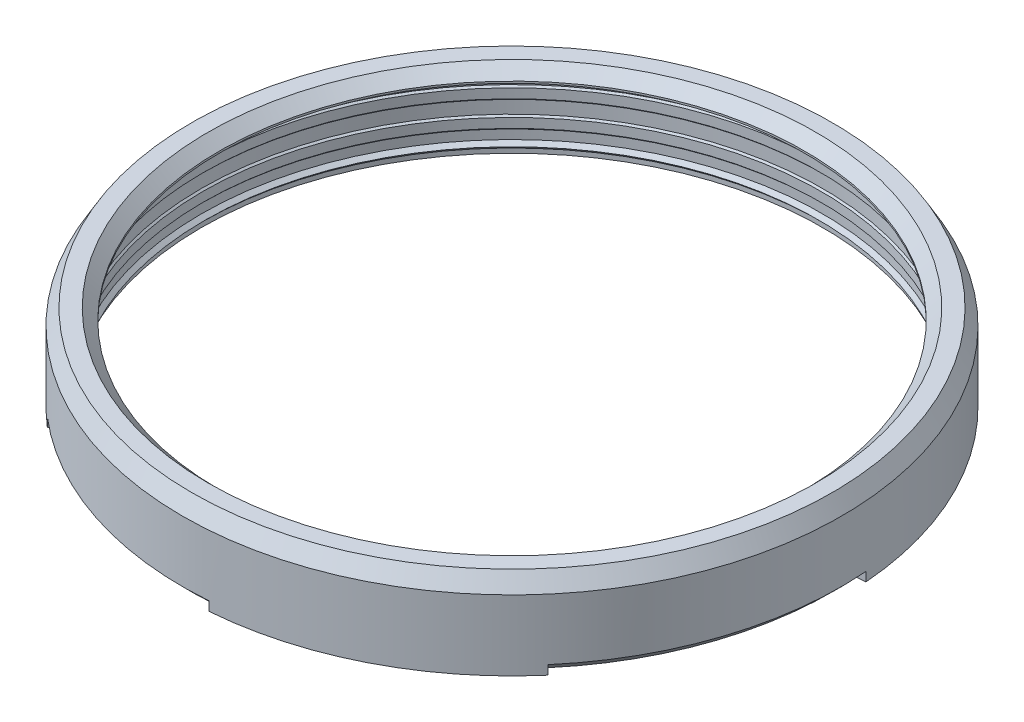
ISO-10303-21;
HEADER;
FILE_DESCRIPTION(('STEP AP214'),'2;1');
FILE_NAME('part.step','',(''),(''),'','','');
FILE_SCHEMA(('AUTOMOTIVE_DESIGN { 1 0 10303 214 1 1 1 1 }'));
ENDSEC;
DATA;
#1=APPLICATION_CONTEXT('core data for automotive mechanical design processes');
#2=APPLICATION_PROTOCOL_DEFINITION('international standard','automotive_design',2000,#1);
#3=PRODUCT_CONTEXT('',#1,'mechanical');
#4=PRODUCT('Part','Part','',(#3));
#5=PRODUCT_RELATED_PRODUCT_CATEGORY('part','',(#4));
#6=PRODUCT_DEFINITION_FORMATION('','',#4);
#7=PRODUCT_DEFINITION_CONTEXT('part definition',#1,'design');
#8=PRODUCT_DEFINITION('design','',#6,#7);
#9=PRODUCT_DEFINITION_SHAPE('','',#8);
#10=(LENGTH_UNIT() NAMED_UNIT(*) SI_UNIT(.MILLI.,.METRE.));
#11=(NAMED_UNIT(*) PLANE_ANGLE_UNIT() SI_UNIT($,.RADIAN.));
#12=(NAMED_UNIT(*) SI_UNIT($,.STERADIAN.) SOLID_ANGLE_UNIT());
#13=UNCERTAINTY_MEASURE_WITH_UNIT(LENGTH_MEASURE(1.E-05),#10,'distance_accuracy_value','');
#14=(GEOMETRIC_REPRESENTATION_CONTEXT(3) GLOBAL_UNCERTAINTY_ASSIGNED_CONTEXT((#13)) GLOBAL_UNIT_ASSIGNED_CONTEXT((#10,
#11,#12)) REPRESENTATION_CONTEXT('',''));
#15=CARTESIAN_POINT('',(0.,0.,0.));
#16=DIRECTION('',(0.,0.,1.));
#17=DIRECTION('',(1.,0.,0.));
#18=AXIS2_PLACEMENT_3D('',#15,#16,#17);
#19=CARTESIAN_POINT('',(0.,2.4,0.));
#20=DIRECTION('',(0.,-1.,0.));
#21=DIRECTION('',(0.,0.,-1.));
#22=AXIS2_PLACEMENT_3D('',#19,#20,#21);
#23=CYLINDRICAL_SURFACE('',#22,36.);
#24=CARTESIAN_POINT('',(0.,-0.33199999999998,0.));
#25=DIRECTION('',(0.,1.,0.));
#26=DIRECTION('',(0.,0.,1.));
#27=AXIS2_PLACEMENT_3D('',#24,#25,#26);
#28=CIRCLE('',#27,36.);
#29=CARTESIAN_POINT('',(0.,-0.33199999999998,36.));
#30=VERTEX_POINT('',#29);
#31=EDGE_CURVE('E314',#30,#30,#28,.F.);
#32=ORIENTED_EDGE('',*,*,#31,.T.);
#33=EDGE_LOOP('',(#32));
#34=FACE_BOUND('',#33,.T.);
#35=CARTESIAN_POINT('',(0.,-8.,0.));
#36=DIRECTION('',(0.,-1.,0.));
#37=DIRECTION('',(1.,0.,0.));
#38=AXIS2_PLACEMENT_3D('',#35,#36,#37);
#39=CIRCLE('',#38,36.);
#40=CARTESIAN_POINT('',(23.4135681346659,-8.,-27.3460203174677));
#41=VERTEX_POINT('',#40);
#42=CARTESIAN_POINT('',(35.892449204742,-8.,-2.7806636051512));
#43=VERTEX_POINT('',#42);
#44=EDGE_CURVE('E155',#41,#43,#39,.T.);
#45=ORIENTED_EDGE('',*,*,#44,.F.);
#46=DIRECTION('',(0.,-1.,0.));
#47=VECTOR('',#46,1.);
#48=CARTESIAN_POINT('',(23.4135681346659,-7.00000000000002,-27.3460203174677));
#49=LINE('',#48,#47);
#50=CARTESIAN_POINT('',(23.4135681346659,-7.00000000000002,-27.3460203174677));
#51=VERTEX_POINT('',#50);
#52=EDGE_CURVE('E196',#51,#41,#49,.T.);
#53=ORIENTED_EDGE('',*,*,#52,.F.);
#54=CARTESIAN_POINT('',(0.,-7.00000000000002,0.));
#55=DIRECTION('',(0.,1.,0.));
#56=DIRECTION('',(0.,0.,-1.));
#57=AXIS2_PLACEMENT_3D('',#54,#55,#56);
#58=CIRCLE('',#57,36.);
#59=CARTESIAN_POINT('',(-2.78066360515108,-7.00000000000002,-35.8924492047421));
#60=VERTEX_POINT('',#59);
#61=EDGE_CURVE('E148',#51,#60,#58,.T.);
#62=ORIENTED_EDGE('',*,*,#61,.T.);
#63=DIRECTION('',(0.,-1.,0.));
#64=VECTOR('',#63,1.);
#65=CARTESIAN_POINT('',(-2.78066360515108,-7.00000000000002,-35.8924492047421));
#66=LINE('',#65,#64);
#67=CARTESIAN_POINT('',(-2.78066360515108,-8.,-35.8924492047421));
#68=VERTEX_POINT('',#67);
#69=EDGE_CURVE('E135',#60,#68,#66,.T.);
#70=ORIENTED_EDGE('',*,*,#69,.T.);
#71=CARTESIAN_POINT('',(-27.3460203174678,-8.,-23.4135681346658));
#72=VERTEX_POINT('',#71);
#73=EDGE_CURVE('E146',#72,#68,#39,.T.);
#74=ORIENTED_EDGE('',*,*,#73,.F.);
#75=DIRECTION('',(0.,-1.,0.));
#76=VECTOR('',#75,1.);
#77=CARTESIAN_POINT('',(-27.3460203174678,-7.00000000000002,-23.4135681346658));
#78=LINE('',#77,#76);
#79=CARTESIAN_POINT('',(-27.3460203174678,-7.00000000000002,-23.4135681346658));
#80=VERTEX_POINT('',#79);
#81=EDGE_CURVE('E183',#80,#72,#78,.T.);
#82=ORIENTED_EDGE('',*,*,#81,.F.);
#83=CARTESIAN_POINT('',(0.,-7.00000000000002,0.));
#84=DIRECTION('',(0.,1.,0.));
#85=DIRECTION('',(-1.,0.,0.));
#86=AXIS2_PLACEMENT_3D('',#83,#84,#85);
#87=CIRCLE('',#86,36.);
#88=CARTESIAN_POINT('',(-35.8924492047421,-7.00000000000002,2.7806636051512));
#89=VERTEX_POINT('',#88);
#90=EDGE_CURVE('E180',#80,#89,#87,.T.);
#91=ORIENTED_EDGE('',*,*,#90,.T.);
#92=DIRECTION('',(0.,-1.,0.));
#93=VECTOR('',#92,1.);
#94=CARTESIAN_POINT('',(-35.8924492047421,-7.00000000000002,2.7806636051512));
#95=LINE('',#94,#93);
#96=CARTESIAN_POINT('',(-35.892449204742,-8.,2.7806636051512));
#97=VERTEX_POINT('',#96);
#98=EDGE_CURVE('E189',#89,#97,#95,.T.);
#99=ORIENTED_EDGE('',*,*,#98,.T.);
#100=CARTESIAN_POINT('',(-23.4135681346661,-8.,27.3460203174676));
#101=VERTEX_POINT('',#100);
#102=EDGE_CURVE('E157',#101,#97,#39,.T.);
#103=ORIENTED_EDGE('',*,*,#102,.F.);
#104=DIRECTION('',(0.,-1.,0.));
#105=VECTOR('',#104,1.);
#106=CARTESIAN_POINT('',(-23.4135681346661,-7.00000000000002,27.3460203174676));
#107=LINE('',#106,#105);
#108=CARTESIAN_POINT('',(-23.4135681346661,-7.00000000000002,27.3460203174676));
#109=VERTEX_POINT('',#108);
#110=EDGE_CURVE('E197',#109,#101,#107,.T.);
#111=ORIENTED_EDGE('',*,*,#110,.F.);
#112=CARTESIAN_POINT('',(0.,-7.00000000000002,0.));
#113=DIRECTION('',(0.,1.,0.));
#114=DIRECTION('',(0.,0.,1.));
#115=AXIS2_PLACEMENT_3D('',#112,#113,#114);
#116=CIRCLE('',#115,36.);
#117=CARTESIAN_POINT('',(2.78066360515083,-7.00000000000002,35.8924492047421));
#118=VERTEX_POINT('',#117);
#119=EDGE_CURVE('E208',#109,#118,#116,.T.);
#120=ORIENTED_EDGE('',*,*,#119,.T.);
#121=DIRECTION('',(0.,-1.,0.));
#122=VECTOR('',#121,1.);
#123=CARTESIAN_POINT('',(2.78066360515083,-7.00000000000002,35.8924492047421));
#124=LINE('',#123,#122);
#125=CARTESIAN_POINT('',(2.78066360515083,-8.,35.8924492047421));
#126=VERTEX_POINT('',#125);
#127=EDGE_CURVE('E214',#118,#126,#124,.T.);
#128=ORIENTED_EDGE('',*,*,#127,.T.);
#129=CARTESIAN_POINT('',(27.3460203174678,-8.,23.4135681346658));
#130=VERTEX_POINT('',#129);
#131=EDGE_CURVE('E162',#130,#126,#39,.T.);
#132=ORIENTED_EDGE('',*,*,#131,.F.);
#133=DIRECTION('',(0.,-1.,0.));
#134=VECTOR('',#133,1.);
#135=CARTESIAN_POINT('',(27.3460203174678,-7.00000000000002,23.4135681346658));
#136=LINE('',#135,#134);
#137=CARTESIAN_POINT('',(27.3460203174678,-7.00000000000002,23.4135681346658));
#138=VERTEX_POINT('',#137);
#139=EDGE_CURVE('E139',#138,#130,#136,.T.);
#140=ORIENTED_EDGE('',*,*,#139,.F.);
#141=CARTESIAN_POINT('',(0.,-7.00000000000002,0.));
#142=DIRECTION('',(0.,1.,0.));
#143=DIRECTION('',(1.,0.,0.));
#144=AXIS2_PLACEMENT_3D('',#141,#142,#143);
#145=CIRCLE('',#144,36.);
#146=CARTESIAN_POINT('',(35.8924492047421,-7.00000000000002,-2.7806636051512));
#147=VERTEX_POINT('',#146);
#148=EDGE_CURVE('E228',#138,#147,#145,.T.);
#149=ORIENTED_EDGE('',*,*,#148,.T.);
#150=DIRECTION('',(0.,-1.,0.));
#151=VECTOR('',#150,1.);
#152=CARTESIAN_POINT('',(35.8924492047421,-7.00000000000002,-2.7806636051512));
#153=LINE('',#152,#151);
#154=EDGE_CURVE('E233',#147,#43,#153,.T.);
#155=ORIENTED_EDGE('',*,*,#154,.T.);
#156=EDGE_LOOP('',(#45,#53,#62,#70,#74,#82,#91,#99,#103,#111,#120,#128,#132,#140,#149,#155));
#157=FACE_BOUND('',#156,.T.);
#158=ADVANCED_FACE('F41',(#34,#157),#23,.T.);
#159=CARTESIAN_POINT('',(0.,-7.6,0.));
#160=DIRECTION('',(0.,1.,0.));
#161=DIRECTION('',(0.,0.,1.));
#162=AXIS2_PLACEMENT_3D('',#159,#160,#161);
#163=CYLINDRICAL_SURFACE('',#162,32.);
#164=CARTESIAN_POINT('',(0.,0.199999999999997,0.));
#165=DIRECTION('',(0.,1.,0.));
#166=DIRECTION('',(0.,0.,1.));
#167=AXIS2_PLACEMENT_3D('',#164,#165,#166);
#168=CIRCLE('',#167,32.);
#169=CARTESIAN_POINT('',(0.,0.199999999999997,32.));
#170=VERTEX_POINT('',#169);
#171=EDGE_CURVE('E11',#170,#170,#168,.T.);
#172=ORIENTED_EDGE('',*,*,#171,.T.);
#173=EDGE_LOOP('',(#172));
#174=FACE_BOUND('',#173,.T.);
#175=CARTESIAN_POINT('',(0.,0.,0.));
#176=DIRECTION('',(0.,1.,0.));
#177=DIRECTION('',(0.,0.,1.));
#178=AXIS2_PLACEMENT_3D('',#175,#176,#177);
#179=CIRCLE('',#178,32.);
#180=CARTESIAN_POINT('',(0.,0.,32.));
#181=VERTEX_POINT('',#180);
#182=EDGE_CURVE('E171',#181,#181,#179,.T.);
#183=ORIENTED_EDGE('',*,*,#182,.F.);
#184=EDGE_LOOP('',(#183));
#185=FACE_BOUND('',#184,.T.);
#186=ADVANCED_FACE('F285',(#174,#185),#163,.F.);
#187=CARTESIAN_POINT('',(0.,-1.5,0.));
#188=DIRECTION('',(0.,-1.,0.));
#189=DIRECTION('',(1.,0.,0.));
#190=AXIS2_PLACEMENT_3D('',#187,#188,#189);
#191=TOROIDAL_SURFACE('',#190,32.44,1.5);
#192=CARTESIAN_POINT('',(0.,0.,0.));
#193=DIRECTION('',(0.,-1.,0.));
#194=DIRECTION('',(1.,0.,0.));
#195=AXIS2_PLACEMENT_3D('',#192,#193,#194);
#196=CIRCLE('',#195,32.44);
#197=CARTESIAN_POINT('',(32.44,0.,0.));
#198=VERTEX_POINT('',#197);
#199=EDGE_CURVE('E164',#198,#198,#196,.T.);
#200=ORIENTED_EDGE('',*,*,#199,.F.);
#201=EDGE_LOOP('',(#200));
#202=FACE_BOUND('',#201,.T.);
#203=CARTESIAN_POINT('',(0.,-1.5,0.));
#204=DIRECTION('',(0.,-1.,0.));
#205=DIRECTION('',(1.,0.,0.));
#206=AXIS2_PLACEMENT_3D('',#203,#204,#205);
#207=CIRCLE('',#206,33.94);
#208=CARTESIAN_POINT('',(33.94,-1.5,0.));
#209=VERTEX_POINT('',#208);
#210=EDGE_CURVE('E319',#209,#209,#207,.T.);
#211=ORIENTED_EDGE('',*,*,#210,.T.);
#212=EDGE_LOOP('',(#211));
#213=FACE_BOUND('',#212,.T.);
#214=ADVANCED_FACE('F291',(#202,#213),#191,.F.);
#215=CARTESIAN_POINT('',(0.,-1.68,0.));
#216=DIRECTION('',(0.,1.,0.));
#217=DIRECTION('',(-1.,0.,0.));
#218=AXIS2_PLACEMENT_3D('',#215,#216,#217);
#219=CONICAL_SURFACE('',#218,33.76,0.785398163397448);
#220=ORIENTED_EDGE('',*,*,#210,.F.);
#221=EDGE_LOOP('',(#220));
#222=FACE_BOUND('',#221,.T.);
#223=CARTESIAN_POINT('',(0.,-1.68,0.));
#224=DIRECTION('',(0.,-1.,0.));
#225=DIRECTION('',(1.,0.,0.));
#226=AXIS2_PLACEMENT_3D('',#223,#224,#225);
#227=CIRCLE('',#226,33.76);
#228=CARTESIAN_POINT('',(33.76,-1.68,0.));
#229=VERTEX_POINT('',#228);
#230=EDGE_CURVE('E323',#229,#229,#227,.T.);
#231=ORIENTED_EDGE('',*,*,#230,.T.);
#232=EDGE_LOOP('',(#231));
#233=FACE_BOUND('',#232,.T.);
#234=ADVANCED_FACE('F407',(#222,#233),#219,.F.);
#235=CARTESIAN_POINT('',(0.,-23.4,0.));
#236=DIRECTION('',(0.,-1.,0.));
#237=DIRECTION('',(1.,0.,0.));
#238=AXIS2_PLACEMENT_3D('',#235,#236,#237);
#239=CYLINDRICAL_SURFACE('',#238,33.76);
#240=ORIENTED_EDGE('',*,*,#230,.F.);
#241=EDGE_LOOP('',(#240));
#242=FACE_BOUND('',#241,.T.);
#243=CARTESIAN_POINT('',(0.,-2.72000000000001,0.));
#244=DIRECTION('',(0.,-1.,0.));
#245=DIRECTION('',(1.,0.,0.));
#246=AXIS2_PLACEMENT_3D('',#243,#244,#245);
#247=CIRCLE('',#246,33.76);
#248=CARTESIAN_POINT('',(33.76,-2.72000000000001,0.));
#249=VERTEX_POINT('',#248);
#250=EDGE_CURVE('E331',#249,#249,#247,.T.);
#251=ORIENTED_EDGE('',*,*,#250,.T.);
#252=EDGE_LOOP('',(#251));
#253=FACE_BOUND('',#252,.T.);
#254=ADVANCED_FACE('F403',(#242,#253),#239,.F.);
#255=CARTESIAN_POINT('',(0.,-2.9,0.));
#256=DIRECTION('',(0.,-1.,0.));
#257=DIRECTION('',(1.,0.,0.));
#258=AXIS2_PLACEMENT_3D('',#255,#256,#257);
#259=CONICAL_SURFACE('',#258,33.94,0.785398163397468);
#260=ORIENTED_EDGE('',*,*,#250,.F.);
#261=EDGE_LOOP('',(#260));
#262=FACE_BOUND('',#261,.T.);
#263=CARTESIAN_POINT('',(0.,-2.9,0.));
#264=DIRECTION('',(0.,-1.,0.));
#265=DIRECTION('',(1.,0.,0.));
#266=AXIS2_PLACEMENT_3D('',#263,#264,#265);
#267=CIRCLE('',#266,33.94);
#268=CARTESIAN_POINT('',(33.94,-2.9,0.));
#269=VERTEX_POINT('',#268);
#270=EDGE_CURVE('E334',#269,#269,#267,.T.);
#271=ORIENTED_EDGE('',*,*,#270,.T.);
#272=EDGE_LOOP('',(#271));
#273=FACE_BOUND('',#272,.T.);
#274=ADVANCED_FACE('F399',(#262,#273),#259,.F.);
#275=CARTESIAN_POINT('',(0.,-23.4,0.));
#276=DIRECTION('',(0.,-1.,0.));
#277=DIRECTION('',(1.,0.,0.));
#278=AXIS2_PLACEMENT_3D('',#275,#276,#277);
#279=CYLINDRICAL_SURFACE('',#278,33.94);
#280=ORIENTED_EDGE('',*,*,#270,.F.);
#281=EDGE_LOOP('',(#280));
#282=FACE_BOUND('',#281,.T.);
#283=CARTESIAN_POINT('',(0.,-4.3,0.));
#284=DIRECTION('',(0.,-1.,0.));
#285=DIRECTION('',(1.,0.,0.));
#286=AXIS2_PLACEMENT_3D('',#283,#284,#285);
#287=CIRCLE('',#286,33.94);
#288=CARTESIAN_POINT('',(33.94,-4.3,0.));
#289=VERTEX_POINT('',#288);
#290=EDGE_CURVE('E337',#289,#289,#287,.T.);
#291=ORIENTED_EDGE('',*,*,#290,.T.);
#292=EDGE_LOOP('',(#291));
#293=FACE_BOUND('',#292,.T.);
#294=ADVANCED_FACE('F395',(#282,#293),#279,.F.);
#295=CARTESIAN_POINT('',(0.,-4.48,0.));
#296=DIRECTION('',(0.,1.,0.));
#297=DIRECTION('',(-1.,0.,0.));
#298=AXIS2_PLACEMENT_3D('',#295,#296,#297);
#299=CONICAL_SURFACE('',#298,33.76,0.785398163397458);
#300=ORIENTED_EDGE('',*,*,#290,.F.);
#301=EDGE_LOOP('',(#300));
#302=FACE_BOUND('',#301,.T.);
#303=CARTESIAN_POINT('',(0.,-4.48,0.));
#304=DIRECTION('',(0.,-1.,0.));
#305=DIRECTION('',(1.,0.,0.));
#306=AXIS2_PLACEMENT_3D('',#303,#304,#305);
#307=CIRCLE('',#306,33.76);
#308=CARTESIAN_POINT('',(33.76,-4.48,0.));
#309=VERTEX_POINT('',#308);
#310=EDGE_CURVE('E340',#309,#309,#307,.T.);
#311=ORIENTED_EDGE('',*,*,#310,.T.);
#312=EDGE_LOOP('',(#311));
#313=FACE_BOUND('',#312,.T.);
#314=ADVANCED_FACE('F391',(#302,#313),#299,.F.);
#315=CARTESIAN_POINT('',(0.,-23.4,0.));
#316=DIRECTION('',(0.,-1.,0.));
#317=DIRECTION('',(1.,0.,0.));
#318=AXIS2_PLACEMENT_3D('',#315,#316,#317);
#319=CYLINDRICAL_SURFACE('',#318,33.76);
#320=ORIENTED_EDGE('',*,*,#310,.F.);
#321=EDGE_LOOP('',(#320));
#322=FACE_BOUND('',#321,.T.);
#323=CARTESIAN_POINT('',(0.,-5.52,0.));
#324=DIRECTION('',(0.,-1.,0.));
#325=DIRECTION('',(1.,0.,0.));
#326=AXIS2_PLACEMENT_3D('',#323,#324,#325);
#327=CIRCLE('',#326,33.76);
#328=CARTESIAN_POINT('',(33.76,-5.52,0.));
#329=VERTEX_POINT('',#328);
#330=EDGE_CURVE('E343',#329,#329,#327,.T.);
#331=ORIENTED_EDGE('',*,*,#330,.T.);
#332=EDGE_LOOP('',(#331));
#333=FACE_BOUND('',#332,.T.);
#334=ADVANCED_FACE('F387',(#322,#333),#319,.F.);
#335=CARTESIAN_POINT('',(0.,-5.7,0.));
#336=DIRECTION('',(0.,-1.,0.));
#337=DIRECTION('',(1.,0.,0.));
#338=AXIS2_PLACEMENT_3D('',#335,#336,#337);
#339=CONICAL_SURFACE('',#338,33.94,0.785398163397468);
#340=ORIENTED_EDGE('',*,*,#330,.F.);
#341=EDGE_LOOP('',(#340));
#342=FACE_BOUND('',#341,.T.);
#343=CARTESIAN_POINT('',(0.,-5.7,0.));
#344=DIRECTION('',(0.,-1.,0.));
#345=DIRECTION('',(1.,0.,0.));
#346=AXIS2_PLACEMENT_3D('',#343,#344,#345);
#347=CIRCLE('',#346,33.94);
#348=CARTESIAN_POINT('',(33.94,-5.7,0.));
#349=VERTEX_POINT('',#348);
#350=EDGE_CURVE('E346',#349,#349,#347,.T.);
#351=ORIENTED_EDGE('',*,*,#350,.T.);
#352=EDGE_LOOP('',(#351));
#353=FACE_BOUND('',#352,.T.);
#354=ADVANCED_FACE('F383',(#342,#353),#339,.F.);
#355=CARTESIAN_POINT('',(0.,-23.4,0.));
#356=DIRECTION('',(0.,-1.,0.));
#357=DIRECTION('',(1.,0.,0.));
#358=AXIS2_PLACEMENT_3D('',#355,#356,#357);
#359=CYLINDRICAL_SURFACE('',#358,33.94);
#360=ORIENTED_EDGE('',*,*,#350,.F.);
#361=EDGE_LOOP('',(#360));
#362=FACE_BOUND('',#361,.T.);
#363=CARTESIAN_POINT('',(0.,-6.7,0.));
#364=DIRECTION('',(0.,-1.,0.));
#365=DIRECTION('',(1.,0.,0.));
#366=AXIS2_PLACEMENT_3D('',#363,#364,#365);
#367=CIRCLE('',#366,33.94);
#368=CARTESIAN_POINT('',(33.94,-6.7,0.));
#369=VERTEX_POINT('',#368);
#370=EDGE_CURVE('E349',#369,#369,#367,.T.);
#371=ORIENTED_EDGE('',*,*,#370,.T.);
#372=EDGE_LOOP('',(#371));
#373=FACE_BOUND('',#372,.T.);
#374=ADVANCED_FACE('F379',(#362,#373),#359,.F.);
#375=CARTESIAN_POINT('',(0.,-7.10000000000002,0.));
#376=DIRECTION('',(0.,1.,0.));
#377=DIRECTION('',(-1.,0.,0.));
#378=AXIS2_PLACEMENT_3D('',#375,#376,#377);
#379=CONICAL_SURFACE('',#378,33.54,0.785398163397427);
#380=ORIENTED_EDGE('',*,*,#370,.F.);
#381=EDGE_LOOP('',(#380));
#382=FACE_BOUND('',#381,.T.);
#383=CARTESIAN_POINT('',(0.,-7.10000000000002,0.));
#384=DIRECTION('',(0.,-1.,0.));
#385=DIRECTION('',(1.,0.,0.));
#386=AXIS2_PLACEMENT_3D('',#383,#384,#385);
#387=CIRCLE('',#386,33.54);
#388=CARTESIAN_POINT('',(33.54,-7.10000000000001,0.));
#389=VERTEX_POINT('',#388);
#390=EDGE_CURVE('E352',#389,#389,#387,.T.);
#391=ORIENTED_EDGE('',*,*,#390,.T.);
#392=EDGE_LOOP('',(#391));
#393=FACE_BOUND('',#392,.T.);
#394=ADVANCED_FACE('F375',(#382,#393),#379,.F.);
#395=CARTESIAN_POINT('',(0.,-7.5,0.));
#396=DIRECTION('',(0.,-1.,0.));
#397=DIRECTION('',(1.,0.,0.));
#398=AXIS2_PLACEMENT_3D('',#395,#396,#397);
#399=CONICAL_SURFACE('',#398,33.94,0.785398163397474);
#400=ORIENTED_EDGE('',*,*,#390,.F.);
#401=EDGE_LOOP('',(#400));
#402=FACE_BOUND('',#401,.T.);
#403=CARTESIAN_POINT('',(0.,-7.5,0.));
#404=DIRECTION('',(0.,-1.,0.));
#405=DIRECTION('',(1.,0.,0.));
#406=AXIS2_PLACEMENT_3D('',#403,#404,#405);
#407=CIRCLE('',#406,33.94);
#408=CARTESIAN_POINT('',(33.94,-7.5,0.));
#409=VERTEX_POINT('',#408);
#410=EDGE_CURVE('E159',#409,#409,#407,.T.);
#411=ORIENTED_EDGE('',*,*,#410,.T.);
#412=EDGE_LOOP('',(#411));
#413=FACE_BOUND('',#412,.T.);
#414=ADVANCED_FACE('F358',(#402,#413),#399,.F.);
#415=CARTESIAN_POINT('',(0.,-23.4,0.));
#416=DIRECTION('',(0.,-1.,0.));
#417=DIRECTION('',(1.,0.,0.));
#418=AXIS2_PLACEMENT_3D('',#415,#416,#417);
#419=CYLINDRICAL_SURFACE('',#418,33.94);
#420=ORIENTED_EDGE('',*,*,#410,.F.);
#421=EDGE_LOOP('',(#420));
#422=FACE_BOUND('',#421,.T.);
#423=CARTESIAN_POINT('',(0.,-8.,0.));
#424=DIRECTION('',(0.,-1.,0.));
#425=DIRECTION('',(1.,0.,0.));
#426=AXIS2_PLACEMENT_3D('',#423,#424,#425);
#427=CIRCLE('',#426,33.94);
#428=CARTESIAN_POINT('',(33.94,-8.,0.));
#429=VERTEX_POINT('',#428);
#430=EDGE_CURVE('E154',#429,#429,#427,.T.);
#431=ORIENTED_EDGE('',*,*,#430,.T.);
#432=EDGE_LOOP('',(#431));
#433=FACE_BOUND('',#432,.T.);
#434=ADVANCED_FACE('F360',(#422,#433),#419,.F.);
#435=CARTESIAN_POINT('',(0.,-8.,0.));
#436=DIRECTION('',(0.,1.,0.));
#437=DIRECTION('',(-1.,0.,0.));
#438=AXIS2_PLACEMENT_3D('',#435,#436,#437);
#439=PLANE('',#438);
#440=ORIENTED_EDGE('',*,*,#430,.F.);
#441=EDGE_LOOP('',(#440));
#442=FACE_BOUND('',#441,.T.);
#443=CARTESIAN_POINT('',(0.,-8.,0.));
#444=DIRECTION('',(0.,1.,0.));
#445=DIRECTION('',(0.,0.,-1.));
#446=AXIS2_PLACEMENT_3D('',#443,#444,#445);
#447=CIRCLE('',#446,35.);
#448=CARTESIAN_POINT('',(22.7631912420363,-8.,-26.5864086419825));
#449=VERTEX_POINT('',#448);
#450=CARTESIAN_POINT('',(-2.70342294945244,-8.,-34.8954367268326));
#451=VERTEX_POINT('',#450);
#452=EDGE_CURVE('E57',#449,#451,#447,.T.);
#453=ORIENTED_EDGE('',*,*,#452,.F.);
#454=DIRECTION('',(-0.650376892629609,0.,0.759611675485214));
#455=VECTOR('',#454,1.);
#456=CARTESIAN_POINT('',(23.4135681346659,-8.,-27.3460203174677));
#457=LINE('',#456,#455);
#458=EDGE_CURVE('E239',#41,#449,#457,.T.);
#459=ORIENTED_EDGE('',*,*,#458,.F.);
#460=ORIENTED_EDGE('',*,*,#44,.T.);
#461=DIRECTION('',(-0.997012477909501,0.,0.0772406556986441));
#462=VECTOR('',#461,1.);
#463=CARTESIAN_POINT('',(35.892449204742,-8.,-2.7806636051512));
#464=LINE('',#463,#462);
#465=CARTESIAN_POINT('',(34.8954367268326,-8.,-2.70342294945256));
#466=VERTEX_POINT('',#465);
#467=EDGE_CURVE('E199',#43,#466,#464,.T.);
#468=ORIENTED_EDGE('',*,*,#467,.T.);
#469=CARTESIAN_POINT('',(0.,-8.,0.));
#470=DIRECTION('',(0.,1.,0.));
#471=DIRECTION('',(1.,0.,0.));
#472=AXIS2_PLACEMENT_3D('',#469,#470,#471);
#473=CIRCLE('',#472,35.);
#474=CARTESIAN_POINT('',(26.5864086419826,-8.,22.7631912420362));
#475=VERTEX_POINT('',#474);
#476=EDGE_CURVE('E65',#475,#466,#473,.T.);
#477=ORIENTED_EDGE('',*,*,#476,.F.);
#478=DIRECTION('',(-0.759611675485217,0.,-0.650376892629606));
#479=VECTOR('',#478,1.);
#480=CARTESIAN_POINT('',(27.3460203174678,-8.,23.4135681346658));
#481=LINE('',#480,#479);
#482=EDGE_CURVE('E221',#130,#475,#481,.T.);
#483=ORIENTED_EDGE('',*,*,#482,.F.);
#484=ORIENTED_EDGE('',*,*,#131,.T.);
#485=DIRECTION('',(-0.0772406556986336,0.,-0.997012477909502));
#486=VECTOR('',#485,1.);
#487=CARTESIAN_POINT('',(2.78066360515083,-8.,35.8924492047421));
#488=LINE('',#487,#486);
#489=CARTESIAN_POINT('',(2.70342294945219,-8.,34.8954367268326));
#490=VERTEX_POINT('',#489);
#491=EDGE_CURVE('E217',#126,#490,#488,.T.);
#492=ORIENTED_EDGE('',*,*,#491,.T.);
#493=CARTESIAN_POINT('',(0.,-8.,0.));
#494=DIRECTION('',(0.,1.,0.));
#495=DIRECTION('',(0.,0.,1.));
#496=AXIS2_PLACEMENT_3D('',#493,#494,#495);
#497=CIRCLE('',#496,35.);
#498=CARTESIAN_POINT('',(-22.7631912420365,-8.,26.5864086419824));
#499=VERTEX_POINT('',#498);
#500=EDGE_CURVE('E203',#499,#490,#497,.T.);
#501=ORIENTED_EDGE('',*,*,#500,.F.);
#502=DIRECTION('',(0.650376892629614,0.,-0.75961167548521));
#503=VECTOR('',#502,1.);
#504=CARTESIAN_POINT('',(-23.4135681346661,-8.,27.3460203174676));
#505=LINE('',#504,#503);
#506=EDGE_CURVE('E200',#101,#499,#505,.T.);
#507=ORIENTED_EDGE('',*,*,#506,.F.);
#508=ORIENTED_EDGE('',*,*,#102,.T.);
#509=DIRECTION('',(0.997012477909501,0.,-0.0772406556986441));
#510=VECTOR('',#509,1.);
#511=CARTESIAN_POINT('',(-35.892449204742,-8.,2.7806636051512));
#512=LINE('',#511,#510);
#513=CARTESIAN_POINT('',(-34.8954367268326,-8.,2.70342294945256));
#514=VERTEX_POINT('',#513);
#515=EDGE_CURVE('E194',#97,#514,#512,.T.);
#516=ORIENTED_EDGE('',*,*,#515,.T.);
#517=CARTESIAN_POINT('',(0.,-8.,0.));
#518=DIRECTION('',(0.,1.,0.));
#519=DIRECTION('',(-1.,0.,0.));
#520=AXIS2_PLACEMENT_3D('',#517,#518,#519);
#521=CIRCLE('',#520,35.);
#522=CARTESIAN_POINT('',(-26.5864086419826,-8.,-22.7631912420362));
#523=VERTEX_POINT('',#522);
#524=EDGE_CURVE('E175',#523,#514,#521,.T.);
#525=ORIENTED_EDGE('',*,*,#524,.F.);
#526=DIRECTION('',(0.759611675485217,0.,0.650376892629606));
#527=VECTOR('',#526,1.);
#528=CARTESIAN_POINT('',(-27.3460203174678,-8.,-23.4135681346658));
#529=LINE('',#528,#527);
#530=EDGE_CURVE('E153',#72,#523,#529,.T.);
#531=ORIENTED_EDGE('',*,*,#530,.F.);
#532=ORIENTED_EDGE('',*,*,#73,.T.);
#533=DIRECTION('',(0.0772406556986406,0.,0.997012477909501));
#534=VECTOR('',#533,1.);
#535=CARTESIAN_POINT('',(-2.78066360515108,-8.,-35.8924492047421));
#536=LINE('',#535,#534);
#537=EDGE_CURVE('E132',#68,#451,#536,.T.);
#538=ORIENTED_EDGE('',*,*,#537,.T.);
#539=EDGE_LOOP('',(#453,#459,#460,#468,#477,#483,#484,#492,#501,#507,#508,#516,#525,#531,#532,#538));
#540=FACE_BOUND('',#539,.T.);
#541=ADVANCED_FACE('F151',(#442,#540),#439,.F.);
#542=CARTESIAN_POINT('',(0.,0.,0.));
#543=DIRECTION('',(0.,1.,0.));
#544=DIRECTION('',(0.,0.,1.));
#545=AXIS2_PLACEMENT_3D('',#542,#543,#544);
#546=PLANE('',#545);
#547=ORIENTED_EDGE('',*,*,#182,.T.);
#548=EDGE_LOOP('',(#547));
#549=FACE_BOUND('',#548,.T.);
#550=ORIENTED_EDGE('',*,*,#199,.T.);
#551=EDGE_LOOP('',(#550));
#552=FACE_BOUND('',#551,.T.);
#553=ADVANCED_FACE('F296',(#549,#552),#546,.F.);
#554=CARTESIAN_POINT('',(0.,1.4,0.));
#555=DIRECTION('',(0.,1.,0.));
#556=DIRECTION('',(0.,0.,1.));
#557=AXIS2_PLACEMENT_3D('',#554,#555,#556);
#558=PLANE('',#557);
#559=CARTESIAN_POINT('',(0.,1.4,0.));
#560=DIRECTION('',(0.,1.,0.));
#561=DIRECTION('',(0.,0.,1.));
#562=AXIS2_PLACEMENT_3D('',#559,#560,#561);
#563=CIRCLE('',#562,33.2);
#564=CARTESIAN_POINT('',(0.,1.4,33.2));
#565=VERTEX_POINT('',#564);
#566=EDGE_CURVE('E50',#565,#565,#563,.F.);
#567=ORIENTED_EDGE('',*,*,#566,.T.);
#568=EDGE_LOOP('',(#567));
#569=FACE_BOUND('',#568,.T.);
#570=CARTESIAN_POINT('',(0.,1.4,0.));
#571=DIRECTION('',(0.,1.,0.));
#572=DIRECTION('',(0.,0.,1.));
#573=AXIS2_PLACEMENT_3D('',#570,#571,#572);
#574=CIRCLE('',#573,35.0000293337636);
#575=CARTESIAN_POINT('',(0.,1.4,35.0000293337636));
#576=VERTEX_POINT('',#575);
#577=EDGE_CURVE('E317',#576,#576,#574,.T.);
#578=ORIENTED_EDGE('',*,*,#577,.T.);
#579=EDGE_LOOP('',(#578));
#580=FACE_BOUND('',#579,.T.);
#581=ADVANCED_FACE('F303',(#569,#580),#558,.T.);
#582=CARTESIAN_POINT('',(0.,1.4,0.));
#583=DIRECTION('',(0.,-1.,0.));
#584=DIRECTION('',(0.,0.,-1.));
#585=AXIS2_PLACEMENT_3D('',#582,#583,#584);
#586=CONICAL_SURFACE('',#585,35.0000293337636,0.523598775598287);
#587=ORIENTED_EDGE('',*,*,#31,.F.);
#588=EDGE_LOOP('',(#587));
#589=FACE_BOUND('',#588,.T.);
#590=ORIENTED_EDGE('',*,*,#577,.F.);
#591=EDGE_LOOP('',(#590));
#592=FACE_BOUND('',#591,.T.);
#593=ADVANCED_FACE('F299',(#589,#592),#586,.T.);
#594=CARTESIAN_POINT('',(0.,1.4,0.));
#595=DIRECTION('',(0.,1.,0.));
#596=DIRECTION('',(0.,0.,1.));
#597=AXIS2_PLACEMENT_3D('',#594,#595,#596);
#598=CONICAL_SURFACE('',#597,33.2,0.785398163397443);
#599=ORIENTED_EDGE('',*,*,#171,.F.);
#600=EDGE_LOOP('',(#599));
#601=FACE_BOUND('',#600,.T.);
#602=ORIENTED_EDGE('',*,*,#566,.F.);
#603=EDGE_LOOP('',(#602));
#604=FACE_BOUND('',#603,.T.);
#605=ADVANCED_FACE('F44',(#601,#604),#598,.F.);
#606=CARTESIAN_POINT('',(0.,-8.,0.));
#607=DIRECTION('',(0.,1.,0.));
#608=DIRECTION('',(-1.,0.,0.));
#609=AXIS2_PLACEMENT_3D('',#606,#607,#608);
#610=CONICAL_SURFACE('',#609,35.,0.785398163397454);
#611=ORIENTED_EDGE('',*,*,#90,.F.);
#612=DIRECTION('',(-0.537126566804075,0.707106781186543,-0.459885911105432));
#613=VECTOR('',#612,1.);
#614=CARTESIAN_POINT('',(-26.5864086419826,-8.,-22.7631912420362));
#615=LINE('',#614,#613);
#616=EDGE_CURVE('E185',#523,#80,#615,.T.);
#617=ORIENTED_EDGE('',*,*,#616,.F.);
#618=ORIENTED_EDGE('',*,*,#524,.T.);
#619=DIRECTION('',(-0.704994284057415,0.707106781186543,0.0546173914278071));
#620=VECTOR('',#619,1.);
#621=CARTESIAN_POINT('',(-34.8954367268326,-8.,2.70342294945256));
#622=LINE('',#621,#620);
#623=EDGE_CURVE('E192',#514,#89,#622,.T.);
#624=ORIENTED_EDGE('',*,*,#623,.T.);
#625=EDGE_LOOP('',(#611,#617,#618,#624));
#626=FACE_BOUND('',#625,.T.);
#627=ADVANCED_FACE('F273',(#626),#610,.T.);
#628=CARTESIAN_POINT('',(0.,0.,0.));
#629=DIRECTION('',(0.650376892629606,0.,-0.759611675485217));
#630=DIRECTION('',(-0.759611675485217,0.,-0.650376892629606));
#631=AXIS2_PLACEMENT_3D('',#628,#629,#630);
#632=PLANE('',#631);
#633=ORIENTED_EDGE('',*,*,#530,.T.);
#634=ORIENTED_EDGE('',*,*,#616,.T.);
#635=ORIENTED_EDGE('',*,*,#81,.T.);
#636=EDGE_LOOP('',(#633,#634,#635));
#637=FACE_BOUND('',#636,.T.);
#638=ADVANCED_FACE('F275',(#637),#632,.F.);
#639=CARTESIAN_POINT('',(0.,0.,0.));
#640=DIRECTION('',(-0.0772406556986441,0.,-0.997012477909501));
#641=DIRECTION('',(-0.997012477909501,0.,0.0772406556986441));
#642=AXIS2_PLACEMENT_3D('',#639,#640,#641);
#643=PLANE('',#642);
#644=ORIENTED_EDGE('',*,*,#515,.F.);
#645=ORIENTED_EDGE('',*,*,#98,.F.);
#646=ORIENTED_EDGE('',*,*,#623,.F.);
#647=EDGE_LOOP('',(#644,#645,#646));
#648=FACE_BOUND('',#647,.T.);
#649=ADVANCED_FACE('F270',(#648),#643,.T.);
#650=CARTESIAN_POINT('',(0.,0.,0.));
#651=DIRECTION('',(-0.75961167548521,0.,-0.650376892629614));
#652=DIRECTION('',(-0.650376892629614,0.,0.75961167548521));
#653=AXIS2_PLACEMENT_3D('',#650,#651,#652);
#654=PLANE('',#653);
#655=ORIENTED_EDGE('',*,*,#506,.T.);
#656=DIRECTION('',(-0.459885911105438,0.707106781186543,0.537126566804071));
#657=VECTOR('',#656,1.);
#658=CARTESIAN_POINT('',(-22.7631912420365,-8.,26.5864086419824));
#659=LINE('',#658,#657);
#660=EDGE_CURVE('E205',#499,#109,#659,.T.);
#661=ORIENTED_EDGE('',*,*,#660,.T.);
#662=ORIENTED_EDGE('',*,*,#110,.T.);
#663=EDGE_LOOP('',(#655,#661,#662));
#664=FACE_BOUND('',#663,.T.);
#665=ADVANCED_FACE('F267',(#664),#654,.F.);
#666=CARTESIAN_POINT('',(0.,-8.,0.));
#667=DIRECTION('',(0.,1.,0.));
#668=DIRECTION('',(0.,0.,1.));
#669=AXIS2_PLACEMENT_3D('',#666,#667,#668);
#670=CONICAL_SURFACE('',#669,35.,0.785398163397454);
#671=ORIENTED_EDGE('',*,*,#119,.F.);
#672=ORIENTED_EDGE('',*,*,#660,.F.);
#673=ORIENTED_EDGE('',*,*,#500,.T.);
#674=DIRECTION('',(0.0546173914277997,0.707106781186543,0.704994284057416));
#675=VECTOR('',#674,1.);
#676=CARTESIAN_POINT('',(2.70342294945219,-8.,34.8954367268326));
#677=LINE('',#676,#675);
#678=EDGE_CURVE('E211',#490,#118,#677,.T.);
#679=ORIENTED_EDGE('',*,*,#678,.T.);
#680=EDGE_LOOP('',(#671,#672,#673,#679));
#681=FACE_BOUND('',#680,.T.);
#682=ADVANCED_FACE('F265',(#681),#670,.T.);
#683=CARTESIAN_POINT('',(0.,0.,0.));
#684=DIRECTION('',(-0.997012477909502,0.,0.0772406556986336));
#685=DIRECTION('',(0.0772406556986336,0.,0.997012477909502));
#686=AXIS2_PLACEMENT_3D('',#683,#684,#685);
#687=PLANE('',#686);
#688=ORIENTED_EDGE('',*,*,#491,.F.);
#689=ORIENTED_EDGE('',*,*,#127,.F.);
#690=ORIENTED_EDGE('',*,*,#678,.F.);
#691=EDGE_LOOP('',(#688,#689,#690));
#692=FACE_BOUND('',#691,.T.);
#693=ADVANCED_FACE('F262',(#692),#687,.T.);
#694=CARTESIAN_POINT('',(0.,0.,0.));
#695=DIRECTION('',(-0.650376892629606,0.,0.759611675485217));
#696=DIRECTION('',(0.759611675485217,0.,0.650376892629606));
#697=AXIS2_PLACEMENT_3D('',#694,#695,#696);
#698=PLANE('',#697);
#699=ORIENTED_EDGE('',*,*,#482,.T.);
#700=DIRECTION('',(0.537126566804075,0.707106781186543,0.459885911105432));
#701=VECTOR('',#700,1.);
#702=CARTESIAN_POINT('',(26.5864086419826,-8.,22.7631912420362));
#703=LINE('',#702,#701);
#704=EDGE_CURVE('E225',#475,#138,#703,.T.);
#705=ORIENTED_EDGE('',*,*,#704,.T.);
#706=ORIENTED_EDGE('',*,*,#139,.T.);
#707=EDGE_LOOP('',(#699,#705,#706));
#708=FACE_BOUND('',#707,.T.);
#709=ADVANCED_FACE('F258',(#708),#698,.F.);
#710=CARTESIAN_POINT('',(0.,-8.,0.));
#711=DIRECTION('',(0.,1.,0.));
#712=DIRECTION('',(1.,0.,0.));
#713=AXIS2_PLACEMENT_3D('',#710,#711,#712);
#714=CONICAL_SURFACE('',#713,35.,0.785398163397454);
#715=ORIENTED_EDGE('',*,*,#148,.F.);
#716=ORIENTED_EDGE('',*,*,#704,.F.);
#717=ORIENTED_EDGE('',*,*,#476,.T.);
#718=DIRECTION('',(0.704994284057415,0.707106781186543,-0.0546173914278071));
#719=VECTOR('',#718,1.);
#720=CARTESIAN_POINT('',(34.8954367268326,-8.,-2.70342294945256));
#721=LINE('',#720,#719);
#722=EDGE_CURVE('E231',#466,#147,#721,.T.);
#723=ORIENTED_EDGE('',*,*,#722,.T.);
#724=EDGE_LOOP('',(#715,#716,#717,#723));
#725=FACE_BOUND('',#724,.T.);
#726=ADVANCED_FACE('F254',(#725),#714,.T.);
#727=CARTESIAN_POINT('',(0.,0.,0.));
#728=DIRECTION('',(0.0772406556986441,0.,0.997012477909501));
#729=DIRECTION('',(0.997012477909501,0.,-0.0772406556986441));
#730=AXIS2_PLACEMENT_3D('',#727,#728,#729);
#731=PLANE('',#730);
#732=ORIENTED_EDGE('',*,*,#467,.F.);
#733=ORIENTED_EDGE('',*,*,#154,.F.);
#734=ORIENTED_EDGE('',*,*,#722,.F.);
#735=EDGE_LOOP('',(#732,#733,#734));
#736=FACE_BOUND('',#735,.T.);
#737=ADVANCED_FACE('F253',(#736),#731,.T.);
#738=CARTESIAN_POINT('',(0.,0.,0.));
#739=DIRECTION('',(0.759611675485214,0.,0.650376892629609));
#740=DIRECTION('',(0.650376892629609,0.,-0.759611675485214));
#741=AXIS2_PLACEMENT_3D('',#738,#739,#740);
#742=PLANE('',#741);
#743=ORIENTED_EDGE('',*,*,#458,.T.);
#744=DIRECTION('',(0.459885911105434,0.707106781186543,-0.537126566804074));
#745=VECTOR('',#744,1.);
#746=CARTESIAN_POINT('',(22.7631912420363,-8.,-26.5864086419825));
#747=LINE('',#746,#745);
#748=EDGE_CURVE('E243',#449,#51,#747,.T.);
#749=ORIENTED_EDGE('',*,*,#748,.T.);
#750=ORIENTED_EDGE('',*,*,#52,.T.);
#751=EDGE_LOOP('',(#743,#749,#750));
#752=FACE_BOUND('',#751,.T.);
#753=ADVANCED_FACE('F249',(#752),#742,.F.);
#754=CARTESIAN_POINT('',(0.,-8.,0.));
#755=DIRECTION('',(0.,1.,0.));
#756=DIRECTION('',(0.,0.,-1.));
#757=AXIS2_PLACEMENT_3D('',#754,#755,#756);
#758=CONICAL_SURFACE('',#757,35.,0.785398163397454);
#759=ORIENTED_EDGE('',*,*,#61,.F.);
#760=ORIENTED_EDGE('',*,*,#748,.F.);
#761=ORIENTED_EDGE('',*,*,#452,.T.);
#762=DIRECTION('',(-0.0546173914278047,0.707106781186543,-0.704994284057416));
#763=VECTOR('',#762,1.);
#764=CARTESIAN_POINT('',(-2.70342294945244,-8.,-34.8954367268326));
#765=LINE('',#764,#763);
#766=EDGE_CURVE('E136',#451,#60,#765,.T.);
#767=ORIENTED_EDGE('',*,*,#766,.T.);
#768=EDGE_LOOP('',(#759,#760,#761,#767));
#769=FACE_BOUND('',#768,.T.);
#770=ADVANCED_FACE('F247',(#769),#758,.T.);
#771=CARTESIAN_POINT('',(0.,0.,0.));
#772=DIRECTION('',(0.997012477909501,0.,-0.0772406556986406));
#773=DIRECTION('',(-0.0772406556986406,0.,-0.997012477909501));
#774=AXIS2_PLACEMENT_3D('',#771,#772,#773);
#775=PLANE('',#774);
#776=ORIENTED_EDGE('',*,*,#537,.F.);
#777=ORIENTED_EDGE('',*,*,#69,.F.);
#778=ORIENTED_EDGE('',*,*,#766,.F.);
#779=EDGE_LOOP('',(#776,#777,#778));
#780=FACE_BOUND('',#779,.T.);
#781=ADVANCED_FACE('F134',(#780),#775,.T.);
#782=CLOSED_SHELL('',(#158,#186,#214,#234,#254,#274,#294,#314,#334,#354,#374,#394,#414,#434,
#541,#553,#581,#593,#605,#627,#638,#649,#665,#682,#693,#709,#726,#737,#753,#770,#781));
#783=MANIFOLD_SOLID_BREP('B2',#782);
#784=ADVANCED_BREP_SHAPE_REPRESENTATION('',(#18,#783),#14);
#785=SHAPE_DEFINITION_REPRESENTATION(#9,#784);
ENDSEC;
END-ISO-10303-21;
